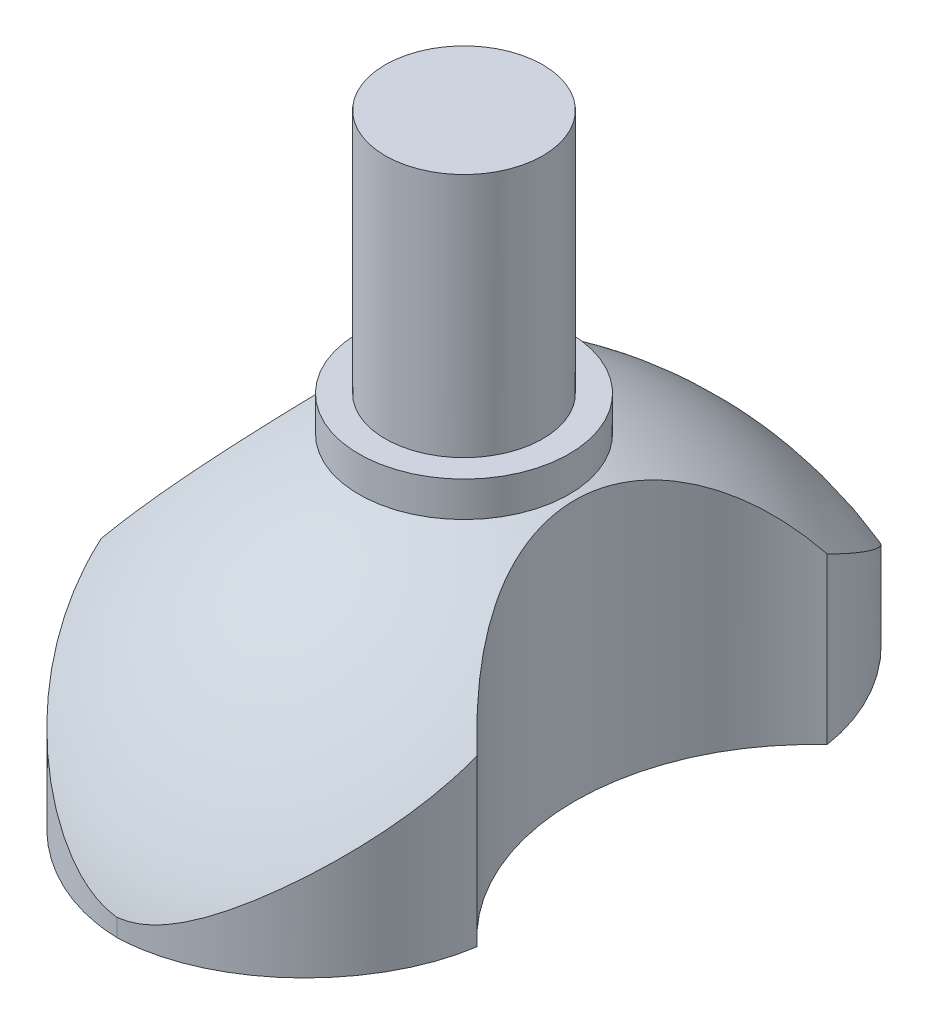
ISO-10303-21;
HEADER;
FILE_DESCRIPTION(('STEP AP214'),'2;1');
FILE_NAME('part.step','',(''),(''),'','','');
FILE_SCHEMA(('AUTOMOTIVE_DESIGN { 1 0 10303 214 1 1 1 1 }'));
ENDSEC;
DATA;
#1=APPLICATION_CONTEXT('core data for automotive mechanical design processes');
#2=APPLICATION_PROTOCOL_DEFINITION('international standard','automotive_design',2000,#1);
#3=PRODUCT_CONTEXT('',#1,'mechanical');
#4=PRODUCT('Part','Part','',(#3));
#5=PRODUCT_RELATED_PRODUCT_CATEGORY('part','',(#4));
#6=PRODUCT_DEFINITION_FORMATION('','',#4);
#7=PRODUCT_DEFINITION_CONTEXT('part definition',#1,'design');
#8=PRODUCT_DEFINITION('design','',#6,#7);
#9=PRODUCT_DEFINITION_SHAPE('','',#8);
#10=(LENGTH_UNIT() NAMED_UNIT(*) SI_UNIT(.MILLI.,.METRE.));
#11=(NAMED_UNIT(*) PLANE_ANGLE_UNIT() SI_UNIT($,.RADIAN.));
#12=(NAMED_UNIT(*) SI_UNIT($,.STERADIAN.) SOLID_ANGLE_UNIT());
#13=UNCERTAINTY_MEASURE_WITH_UNIT(LENGTH_MEASURE(1.E-05),#10,'distance_accuracy_value','');
#14=(GEOMETRIC_REPRESENTATION_CONTEXT(3) GLOBAL_UNCERTAINTY_ASSIGNED_CONTEXT((#13)) GLOBAL_UNIT_ASSIGNED_CONTEXT((#10,
#11,#12)) REPRESENTATION_CONTEXT('',''));
#15=CARTESIAN_POINT('',(0.,0.,0.));
#16=DIRECTION('',(0.,0.,1.));
#17=DIRECTION('',(1.,0.,0.));
#18=AXIS2_PLACEMENT_3D('',#15,#16,#17);
#19=CARTESIAN_POINT('',(0.,10.5,0.));
#20=DIRECTION('',(0.,-1.,0.));
#21=DIRECTION('',(0.,0.,-1.));
#22=AXIS2_PLACEMENT_3D('',#19,#20,#21);
#23=CYLINDRICAL_SURFACE('',#22,2.25);
#24=CARTESIAN_POINT('',(0.,-9.5,0.));
#25=DIRECTION('',(0.,-1.,0.));
#26=DIRECTION('',(0.,0.,-1.));
#27=AXIS2_PLACEMENT_3D('',#24,#25,#26);
#28=CIRCLE('',#27,2.25);
#29=CARTESIAN_POINT('',(0.,-9.5,-2.25));
#30=VERTEX_POINT('',#29);
#31=EDGE_CURVE('E366',#30,#30,#28,.T.);
#32=ORIENTED_EDGE('',*,*,#31,.F.);
#33=EDGE_LOOP('',(#32));
#34=FACE_BOUND('',#33,.T.);
#35=CARTESIAN_POINT('',(0.,-2.5,0.));
#36=DIRECTION('',(0.,1.,0.));
#37=DIRECTION('',(0.,0.,1.));
#38=AXIS2_PLACEMENT_3D('',#35,#36,#37);
#39=CIRCLE('',#38,2.25);
#40=CARTESIAN_POINT('',(0.,-2.5,2.25));
#41=VERTEX_POINT('',#40);
#42=EDGE_CURVE('E372',#41,#41,#39,.T.);
#43=ORIENTED_EDGE('',*,*,#42,.F.);
#44=EDGE_LOOP('',(#43));
#45=FACE_BOUND('',#44,.T.);
#46=ADVANCED_FACE('F84',(#34,#45),#23,.T.);
#47=CARTESIAN_POINT('',(0.,-21.1223259738244,0.));
#48=DIRECTION('',(0.,1.,0.));
#49=DIRECTION('',(0.,0.,1.));
#50=AXIS2_PLACEMENT_3D('',#47,#48,#49);
#51=DEGENERATE_TOROIDAL_SURFACE('',#50,0.75678197360062,11.2670856875838,.F.);
#52=CARTESIAN_POINT('',(-1.21778223944735E-13,-17.5,-9.91214367196992));
#53=CARTESIAN_POINT('',(0.0647477005345895,-17.4946067585579,-9.91031368422851));
#54=CARTESIAN_POINT('',(0.129249586201387,-17.4870614492552,-9.90711200341178));
#55=CARTESIAN_POINT('',(0.257252110956025,-17.4680748704095,-9.89811957970973));
#56=CARTESIAN_POINT('',(0.320755587004106,-17.4566482356384,-9.8923385371578));
#57=CARTESIAN_POINT('',(0.44667165352418,-17.4302753839606,-9.87833343250229));
#58=CARTESIAN_POINT('',(0.509085332201232,-17.4153329225815,-9.87011197476161));
#59=CARTESIAN_POINT('',(0.63176346858373,-17.3825996210537,-9.85152857628659));
#60=CARTESIAN_POINT('',(0.692046269754101,-17.3648569282479,-9.84120208299128));
#61=CARTESIAN_POINT('',(0.811429324134805,-17.3267366247479,-9.81847122950752));
#62=CARTESIAN_POINT('',(0.870528482638801,-17.306356694157,-9.80606503699899));
#63=CARTESIAN_POINT('',(0.987471619687195,-17.2633341117187,-9.7793164860475));
#64=CARTESIAN_POINT('',(1.04531504172813,-17.2406904806172,-9.76497328872617));
#65=CARTESIAN_POINT('',(1.23597203860407,-17.1620320563342,-9.71416187021926));
#66=CARTESIAN_POINT('',(1.36598082886827,-17.1017546389045,-9.67367885534412));
#67=CARTESIAN_POINT('',(1.61940805762656,-16.9742268462301,-9.58420001750592));
#68=CARTESIAN_POINT('',(1.74282397785496,-16.9069738349792,-9.53520097166048));
#69=CARTESIAN_POINT('',(1.98475438765377,-16.7672044417295,-9.42909059816223));
#70=CARTESIAN_POINT('',(2.10321176639496,-16.6946444532778,-9.37190721288339));
#71=CARTESIAN_POINT('',(2.33447257656536,-16.5464878782339,-9.2504167776728));
#72=CARTESIAN_POINT('',(2.44727412292801,-16.4708902941479,-9.18610737529229));
#73=CARTESIAN_POINT('',(2.64452073620498,-16.3337992541814,-9.06496516239648));
#74=CARTESIAN_POINT('',(2.72997307029374,-16.2726527169959,-9.00937052500072));
#75=CARTESIAN_POINT('',(2.89759254191193,-16.1495943370741,-8.89420920937448));
#76=CARTESIAN_POINT('',(2.97975935249957,-16.0876824189735,-8.83464213741347));
#77=CARTESIAN_POINT('',(3.22144545118996,-15.9012441340186,-8.6501793034527));
#78=CARTESIAN_POINT('',(3.37611645243204,-15.7760391307103,-8.51954292809712));
#79=CARTESIAN_POINT('',(3.67183744784265,-15.5257811030856,-8.24439762752949));
#80=CARTESIAN_POINT('',(3.81291419696271,-15.4007282791758,-8.09991711571389));
#81=CARTESIAN_POINT('',(4.08088472842309,-15.1513453111415,-7.79785028107827));
#82=CARTESIAN_POINT('',(4.20778257901542,-15.0270149694766,-7.64026774028153));
#83=CARTESIAN_POINT('',(4.43464827691055,-14.7912380255469,-7.32865339207626));
#84=CARTESIAN_POINT('',(4.53603085862786,-14.6796960017916,-7.17572225084255));
#85=CARTESIAN_POINT('',(4.72480081410834,-14.457461808117,-6.86078819901495));
#86=CARTESIAN_POINT('',(4.81218588834573,-14.3467697806739,-6.69878380374488));
#87=CARTESIAN_POINT('',(4.9711765577493,-14.1264697499647,-6.3672300578446));
#88=CARTESIAN_POINT('',(5.04282467270177,-14.0168596093757,-6.19770256362753));
#89=CARTESIAN_POINT('',(5.16890332412444,-13.7983260077099,-5.85203784857904));
#90=CARTESIAN_POINT('',(5.22334626420388,-13.689402107684,-5.67590549229403));
#91=CARTESIAN_POINT('',(5.28926290248487,-13.5301402923031,-5.41400317633487));
#92=CARTESIAN_POINT('',(5.30815914752043,-13.4795712847026,-5.33019392587244));
#93=CARTESIAN_POINT('',(5.34165611268871,-13.3785627364975,-5.1616792005404));
#94=CARTESIAN_POINT('',(5.35625807372028,-13.3281231626756,-5.07697399191548));
#95=CARTESIAN_POINT('',(5.36863090488632,-13.2777342750005,-4.99189260054224));
#96=B_SPLINE_CURVE_WITH_KNOTS('',3,(#52,#53,#54,#55,#56,#57,#58,#59,#60,#61,#62,#63,#64,#65,#66,
#67,#68,#69,#70,#71,#72,#73,#74,#75,#76,#77,#78,#79,#80,#81,#82,#83,#84,#85,#86,#87,#88,#89,#90,
#91,#92,#93,#94,#95),.UNSPECIFIED.,.F.,.F.,(4,2,2,2,2,2,2,2,2,2,2,2,2,2,2,2,2,2,2,2,2,4),(0.,
0.194902647755819,0.389078414018322,0.583047700208907,0.77398660462994,0.965094628657648,
1.15628568479612,1.60223463063321,2.04835271431165,2.49867248137015,2.94914135389517,
3.30565560866396,3.66220525225237,4.37544367016085,5.08724839031406,5.79884835001407,
6.4424216904455,7.08610064961366,7.72801844973967,8.36947241513621,8.66846196168819,
8.96736502556779),.UNSPECIFIED.);
#97=CARTESIAN_POINT('',(0.,-17.5,-9.91214367196991));
#98=VERTEX_POINT('',#97);
#99=CARTESIAN_POINT('',(5.36863090488632,-13.2777342750003,-4.99189260054224));
#100=VERTEX_POINT('',#99);
#101=EDGE_CURVE('E243',#98,#100,#96,.T.);
#102=ORIENTED_EDGE('',*,*,#101,.F.);
#103=CARTESIAN_POINT('',(0.,-17.5,-9.91214367196991));
#104=CARTESIAN_POINT('',(-0.0647477005346489,-17.4946067585579,-9.9103136842285));
#105=CARTESIAN_POINT('',(-0.129249586201438,-17.4870614492552,-9.90711200341177));
#106=CARTESIAN_POINT('',(-0.257252110956058,-17.4680748704095,-9.89811957970973));
#107=CARTESIAN_POINT('',(-0.32075558700413,-17.4566482356384,-9.8923385371578));
#108=CARTESIAN_POINT('',(-0.446671653524183,-17.4302753839605,-9.87833343250228));
#109=CARTESIAN_POINT('',(-0.509085332201223,-17.4153329225815,-9.87011197476161));
#110=CARTESIAN_POINT('',(-0.631763468583701,-17.3825996210537,-9.85152857628659));
#111=CARTESIAN_POINT('',(-0.692046269754065,-17.3648569282479,-9.84120208299128));
#112=CARTESIAN_POINT('',(-0.811429324134752,-17.3267366247479,-9.81847122950753));
#113=CARTESIAN_POINT('',(-0.870528482638737,-17.306356694157,-9.806065036999));
#114=CARTESIAN_POINT('',(-0.987471619687112,-17.2633341117187,-9.7793164860475));
#115=CARTESIAN_POINT('',(-1.04531504172804,-17.2406904806172,-9.76497328872619));
#116=CARTESIAN_POINT('',(-1.23597203860397,-17.1620320563342,-9.71416187021927));
#117=CARTESIAN_POINT('',(-1.36598082886816,-17.1017546389045,-9.67367885534413));
#118=CARTESIAN_POINT('',(-1.61940805762645,-16.9742268462301,-9.58420001750594));
#119=CARTESIAN_POINT('',(-1.74282397785485,-16.9069738349791,-9.5352009716605));
#120=CARTESIAN_POINT('',(-1.98475438765365,-16.7672044417295,-9.42909059816225));
#121=CARTESIAN_POINT('',(-2.10321176639484,-16.6946444532778,-9.37190721288341));
#122=CARTESIAN_POINT('',(-2.33447257656524,-16.5464878782339,-9.25041677767282));
#123=CARTESIAN_POINT('',(-2.44727412292789,-16.4708902941479,-9.18610737529231));
#124=CARTESIAN_POINT('',(-2.64452073620486,-16.3337992541813,-9.0649651623965));
#125=CARTESIAN_POINT('',(-2.72997307029363,-16.2726527169959,-9.00937052500075));
#126=CARTESIAN_POINT('',(-2.89759254191183,-16.1495943370741,-8.89420920937449));
#127=CARTESIAN_POINT('',(-2.97975935249947,-16.0876824189734,-8.83464213741348));
#128=CARTESIAN_POINT('',(-3.22144545118988,-15.9012441340186,-8.65017930345269));
#129=CARTESIAN_POINT('',(-3.37611645243197,-15.7760391307103,-8.51954292809711));
#130=CARTESIAN_POINT('',(-3.67183744784261,-15.5257811030856,-8.24439762752947));
#131=CARTESIAN_POINT('',(-3.81291419696268,-15.4007282791757,-8.09991711571386));
#132=CARTESIAN_POINT('',(-4.08088472842308,-15.1513453111415,-7.79785028107822));
#133=CARTESIAN_POINT('',(-4.20778257901541,-15.0270149694765,-7.64026774028147));
#134=CARTESIAN_POINT('',(-4.43464827691055,-14.7912380255468,-7.32865339207619));
#135=CARTESIAN_POINT('',(-4.53603085862787,-14.6796960017915,-7.17572225084249));
#136=CARTESIAN_POINT('',(-4.72480081410834,-14.4574618081169,-6.8607881990149));
#137=CARTESIAN_POINT('',(-4.81218588834572,-14.3467697806738,-6.69878380374483));
#138=CARTESIAN_POINT('',(-4.97117655774929,-14.1264697499647,-6.36723005784458));
#139=CARTESIAN_POINT('',(-5.04282467270177,-14.0168596093757,-6.19770256362751));
#140=CARTESIAN_POINT('',(-5.16890332412444,-13.7983260077099,-5.85203784857903));
#141=CARTESIAN_POINT('',(-5.22334626420387,-13.689402107684,-5.67590549229403));
#142=CARTESIAN_POINT('',(-5.28926290248487,-13.5301402923031,-5.41400317633487));
#143=CARTESIAN_POINT('',(-5.30815914752042,-13.4795712847026,-5.33019392587244));
#144=CARTESIAN_POINT('',(-5.34165611268871,-13.3785627364975,-5.16167920054041));
#145=CARTESIAN_POINT('',(-5.35625807372027,-13.3281231626756,-5.07697399191549));
#146=CARTESIAN_POINT('',(-5.36863090488632,-13.2777342750005,-4.99189260054224));
#147=B_SPLINE_CURVE_WITH_KNOTS('',3,(#103,#104,#105,#106,#107,#108,#109,#110,#111,#112,#113,
#114,#115,#116,#117,#118,#119,#120,#121,#122,#123,#124,#125,#126,#127,#128,#129,#130,#131,#132,
#133,#134,#135,#136,#137,#138,#139,#140,#141,#142,#143,#144,#145,#146),.UNSPECIFIED.,.F.,.F.,(4,
2,2,2,2,2,2,2,2,2,2,2,2,2,2,2,2,2,2,2,2,4),(0.,0.19490264775579,0.389078414018266,
0.583047700208822,0.773986604629827,0.965094628657508,1.15628568479595,1.60223463063304,
2.04835271431148,2.49867248136997,2.94914135389498,3.30565560866381,3.66220525225223,
4.37544367016076,5.08724839031401,5.79884835001406,6.44242169044546,7.08610064961359,
7.72801844973957,8.36947241513609,8.66846196168807,8.96736502556768),.UNSPECIFIED.);
#148=CARTESIAN_POINT('',(-5.36863090488631,-13.2777342750005,-4.99189260054225));
#149=VERTEX_POINT('',#148);
#150=EDGE_CURVE('E202',#98,#149,#147,.T.);
#151=ORIENTED_EDGE('',*,*,#150,.T.);
#152=CARTESIAN_POINT('',(-5.36883090488642,-13.2780130804902,-4.99207462889494));
#153=CARTESIAN_POINT('',(-5.27535609658321,-13.1477010865516,-4.90699335529709));
#154=CARTESIAN_POINT('',(-5.18196344268316,-13.0204440789122,-4.81720215599376));
#155=CARTESIAN_POINT('',(-4.99635504739702,-12.7724065703114,-4.62765279085653));
#156=CARTESIAN_POINT('',(-4.90414060708838,-12.6516328248321,-4.52788452737752));
#157=CARTESIAN_POINT('',(-4.62982953154358,-12.2983748828887,-4.21163080564306));
#158=CARTESIAN_POINT('',(-4.45137621821553,-12.0767533304604,-3.97934842613928));
#159=CARTESIAN_POINT('',(-4.13547890590171,-11.6930802906074,-3.50205874898593));
#160=CARTESIAN_POINT('',(-3.99568144615711,-11.5270804514505,-3.26183433458899));
#161=CARTESIAN_POINT('',(-3.80487493080433,-11.3030195236937,-2.8782221430621));
#162=CARTESIAN_POINT('',(-3.74447210993188,-11.2325471590438,-2.74661556295001));
#163=CARTESIAN_POINT('',(-3.63092800284866,-11.100565811303,-2.47595149900243));
#164=CARTESIAN_POINT('',(-3.57778542291686,-11.0390552311586,-2.33689534878903));
#165=CARTESIAN_POINT('',(-3.48784559525522,-10.9351243283966,-2.07527982690474));
#166=CARTESIAN_POINT('',(-3.44979631275813,-10.8912268731226,-1.95373503077379));
#167=CARTESIAN_POINT('',(-3.38013640371041,-10.8108715624063,-1.70642177171612));
#168=CARTESIAN_POINT('',(-3.34852452054477,-10.7744122549948,-1.5806541387043));
#169=CARTESIAN_POINT('',(-3.29228462719624,-10.7094961903514,-1.32552938164424));
#170=CARTESIAN_POINT('',(-3.26765665640189,-10.6810394782532,-1.19617223735604));
#171=CARTESIAN_POINT('',(-3.22586655469137,-10.6326934119998,-0.934726080354175));
#172=CARTESIAN_POINT('',(-3.20870123885006,-10.6128004030477,-0.802638258307303));
#173=CARTESIAN_POINT('',(-3.18211534350614,-10.5819592567908,-0.535966879445243));
#174=CARTESIAN_POINT('',(-3.17273379236871,-10.5710561974246,-0.401374164654344));
#175=CARTESIAN_POINT('',(-3.16207186344806,-10.5586630711623,-0.131433291967229));
#176=CARTESIAN_POINT('',(-3.16079141556218,-10.557172922812,0.00391485938169381));
#177=CARTESIAN_POINT('',(-3.16636146250929,-10.56364933372,0.274223973664342));
#178=CARTESIAN_POINT('',(-3.17321253692984,-10.5716165670687,0.409184908311222));
#179=CARTESIAN_POINT('',(-3.19488940996727,-10.5967822542187,0.677587634762747));
#180=CARTESIAN_POINT('',(-3.20971508426506,-10.6139805641132,0.811029450216411));
#181=CARTESIAN_POINT('',(-3.24558881225554,-10.6555175402743,1.06523982183928));
#182=CARTESIAN_POINT('',(-3.26607235453258,-10.6792073227387,1.18619535942318));
#183=CARTESIAN_POINT('',(-3.31321130891947,-10.7336596123874,1.42529416163185));
#184=CARTESIAN_POINT('',(-3.33986880443375,-10.764424507048,1.54343646205319));
#185=CARTESIAN_POINT('',(-3.42846608515182,-10.8666196842203,1.89260422147759));
#186=CARTESIAN_POINT('',(-3.49906821569414,-10.9479939081403,2.11862778935989));
#187=CARTESIAN_POINT('',(-3.66853510361632,-11.1441203822955,2.57807915535037));
#188=CARTESIAN_POINT('',(-3.7696885774862,-11.261601090899,2.80946971443188));
#189=CARTESIAN_POINT('',(-3.9904632091592,-11.5210636465043,3.24913025267281));
#190=CARTESIAN_POINT('',(-4.11012506650862,-11.6630995729591,3.45734749593119));
#191=CARTESIAN_POINT('',(-4.32289803154928,-11.92037074524,3.78794974762746));
#192=CARTESIAN_POINT('',(-4.41265481752965,-12.0301545758416,3.91685506433931));
#193=CARTESIAN_POINT('',(-4.59666236256604,-12.2587180989238,4.16314619465189));
#194=CARTESIAN_POINT('',(-4.690915798484,-12.3775031752482,4.28052501609932));
#195=CARTESIAN_POINT('',(-4.88178525052645,-12.6224965361955,4.50326567646799));
#196=CARTESIAN_POINT('',(-4.97838594210281,-12.7486617403222,4.60868840498661));
#197=CARTESIAN_POINT('',(-5.17292147963193,-13.0081274920236,4.80850116974975));
#198=CARTESIAN_POINT('',(-5.27085436400221,-13.14141825001,4.90290580293017));
#199=CARTESIAN_POINT('',(-5.36883090488642,-13.2780130804902,4.99207462889494));
#200=B_SPLINE_CURVE_WITH_KNOTS('',3,(#152,#153,#154,#155,#156,#157,#158,#159,#160,#161,#162,
#163,#164,#165,#166,#167,#168,#169,#170,#171,#172,#173,#174,#175,#176,#177,#178,#179,#180,#181,
#182,#183,#184,#185,#186,#187,#188,#189,#190,#191,#192,#193,#194,#195,#196,#197,#198,#199),
.UNSPECIFIED.,.F.,.F.,(4,2,2,2,2,2,2,2,2,2,2,2,2,2,2,2,2,2,2,2,2,2,2,4),(0.,0.544457565105858,
1.08947185471803,2.18695859114245,3.15417933203535,3.63682393356446,4.11938241891897,
4.52313402423819,4.92680673935848,5.33048173110563,5.7339842721948,6.13949798252163,
6.54500818374266,6.95054729010276,7.35608007454108,7.73050672345619,8.1050599074529,
8.85338389275275,9.68605954138588,10.5205929643013,11.0949290981871,11.6696115086398,
12.2412215888459,12.8120655825852),.UNSPECIFIED.);
#201=CARTESIAN_POINT('',(-5.36863090488634,-13.2777342750009,4.99189260054269));
#202=VERTEX_POINT('',#201);
#203=EDGE_CURVE('E106',#149,#202,#200,.T.);
#204=ORIENTED_EDGE('',*,*,#203,.T.);
#205=CARTESIAN_POINT('',(0.,-17.5,9.91214367196992));
#206=CARTESIAN_POINT('',(-0.0647477005344992,-17.494606758558,9.91031368422855));
#207=CARTESIAN_POINT('',(-0.129249586201094,-17.4870614492555,9.90711200341186));
#208=CARTESIAN_POINT('',(-0.257252110955337,-17.46807487041,9.89811957970992));
#209=CARTESIAN_POINT('',(-0.320755587003227,-17.456648235639,9.89233853715805));
#210=CARTESIAN_POINT('',(-0.446671653522927,-17.4302753839615,9.87833343250266));
#211=CARTESIAN_POINT('',(-0.509085332199795,-17.4153329225825,9.87011197476205));
#212=CARTESIAN_POINT('',(-0.63176346858194,-17.3825996210551,9.85152857628718));
#213=CARTESIAN_POINT('',(-0.692046269752142,-17.3648569282494,9.84120208299195));
#214=CARTESIAN_POINT('',(-0.811429324132509,-17.3267366247497,9.81847122950835));
#215=CARTESIAN_POINT('',(-0.870528482636339,-17.306356694159,9.80606503699991));
#216=CARTESIAN_POINT('',(-0.987471619684407,-17.2633341117209,9.77931648604859));
#217=CARTESIAN_POINT('',(-1.04531504172518,-17.2406904806196,9.76497328872737));
#218=CARTESIAN_POINT('',(-1.23597203860048,-17.1620320563371,9.71416187022082));
#219=CARTESIAN_POINT('',(-1.36598082886422,-17.1017546389078,9.67367885534597));
#220=CARTESIAN_POINT('',(-1.61940805762162,-16.9742268462343,9.58420001750841));
#221=CARTESIAN_POINT('',(-1.7428239778496,-16.9069738349837,9.53520097166332));
#222=CARTESIAN_POINT('',(-1.98475438764757,-16.7672044417348,9.42909059816581));
#223=CARTESIAN_POINT('',(-2.10321176638836,-16.6946444532836,9.37190721288737));
#224=CARTESIAN_POINT('',(-2.334472576558,-16.5464878782404,9.25041677767763));
#225=CARTESIAN_POINT('',(-2.44727412292028,-16.4708902941548,9.18610737529756));
#226=CARTESIAN_POINT('',(-2.64452073619691,-16.3337992541887,9.06496516240242));
#227=CARTESIAN_POINT('',(-2.72997307028567,-16.2726527170033,9.00937052500687));
#228=CARTESIAN_POINT('',(-2.89759254190387,-16.1495943370817,8.89420920938103));
#229=CARTESIAN_POINT('',(-2.97975935249152,-16.0876824189811,8.83464213742022));
#230=CARTESIAN_POINT('',(-3.22144545118193,-15.9012441340265,8.65017930346007));
#231=CARTESIAN_POINT('',(-3.37611645242404,-15.7760391307183,8.51954292810491));
#232=CARTESIAN_POINT('',(-3.67183744783475,-15.5257811030938,8.24439762753814));
#233=CARTESIAN_POINT('',(-3.81291419695487,-15.400728279184,8.09991711572297));
#234=CARTESIAN_POINT('',(-4.08088472841544,-15.15134531115,7.79785028108823));
#235=CARTESIAN_POINT('',(-4.20778257900789,-15.0270149694851,7.64026774029194));
#236=CARTESIAN_POINT('',(-4.43464827690352,-14.7912380255554,7.32865339208724));
#237=CARTESIAN_POINT('',(-4.53603085862119,-14.6796960017999,7.17572225085365));
#238=CARTESIAN_POINT('',(-4.72480081410239,-14.4574618081251,6.86078819902623));
#239=CARTESIAN_POINT('',(-4.81218588834014,-14.3467697806818,6.69878380375624));
#240=CARTESIAN_POINT('',(-4.97117655774446,-14.1264697499724,6.36723005785609));
#241=CARTESIAN_POINT('',(-5.04282467269731,-14.0168596093832,6.19770256363906));
#242=CARTESIAN_POINT('',(-5.16890332412077,-13.7983260077172,5.85203784859062));
#243=CARTESIAN_POINT('',(-5.2233462642006,-13.6894021076912,5.67590549230561));
#244=CARTESIAN_POINT('',(-5.28926290248263,-13.530140292309,5.41400317634466));
#245=CARTESIAN_POINT('',(-5.30815914751873,-13.4795712847074,5.33019392588044));
#246=CARTESIAN_POINT('',(-5.34165611268792,-13.3785627365001,5.16167920054477));
#247=CARTESIAN_POINT('',(-5.35625807371984,-13.3281231626771,5.07697399191801));
#248=CARTESIAN_POINT('',(-5.36863090488615,-13.2777342750009,4.99189260054291));
#249=B_SPLINE_CURVE_WITH_KNOTS('',3,(#205,#206,#207,#208,#209,#210,#211,#212,#213,#214,#215,
#216,#217,#218,#219,#220,#221,#222,#223,#224,#225,#226,#227,#228,#229,#230,#231,#232,#233,#234,
#235,#236,#237,#238,#239,#240,#241,#242,#243,#244,#245,#246,#247,#248),.UNSPECIFIED.,.F.,.F.,(4,
2,2,2,2,2,2,2,2,2,2,2,2,2,2,2,2,2,2,2,2,4),(0.,0.194902647755163,0.389078414017015,
0.583047700206947,0.773986604627332,0.965094628654391,1.15628568479221,1.60223463062736,
2.04835271430385,2.49867248136039,2.94914135388344,3.30565560865182,3.66220525223981,
4.37544367014748,5.08724839029987,5.79884834999906,6.44242169043097,7.08610064959961,
7.72801844972609,8.36947241512311,8.66846196168163,8.96736502556778),.UNSPECIFIED.);
#250=CARTESIAN_POINT('',(0.,-17.5,9.91214367196992));
#251=VERTEX_POINT('',#250);
#252=EDGE_CURVE('E189',#251,#202,#249,.T.);
#253=ORIENTED_EDGE('',*,*,#252,.F.);
#254=CARTESIAN_POINT('',(0.,-17.5,9.91214367196992));
#255=CARTESIAN_POINT('',(0.0647477005347479,-17.4946067585579,9.91031368422851));
#256=CARTESIAN_POINT('',(0.129249586201582,-17.4870614492552,9.90711200341177));
#257=CARTESIAN_POINT('',(0.257252110956294,-17.4680748704095,9.89811957970972));
#258=CARTESIAN_POINT('',(0.320755587004412,-17.4566482356384,9.89233853715779));
#259=CARTESIAN_POINT('',(0.446671653524558,-17.4302753839605,9.87833343250226));
#260=CARTESIAN_POINT('',(0.509085332201644,-17.4153329225814,9.87011197476158));
#261=CARTESIAN_POINT('',(0.631763468584214,-17.3825996210537,9.85152857628654));
#262=CARTESIAN_POINT('',(0.692046269754624,-17.3648569282479,9.84120208299123));
#263=CARTESIAN_POINT('',(0.811429324135403,-17.3267366247479,9.81847122950745));
#264=CARTESIAN_POINT('',(0.870528482639435,-17.306356694157,9.80606503699892));
#265=CARTESIAN_POINT('',(0.9874716196879,-17.2633341117186,9.7793164860474));
#266=CARTESIAN_POINT('',(1.04531504172887,-17.2406904806172,9.76497328872607));
#267=CARTESIAN_POINT('',(1.2359720386049,-17.1620320563341,9.71416187021912));
#268=CARTESIAN_POINT('',(1.36598082886917,-17.1017546389044,9.67367885534396));
#269=CARTESIAN_POINT('',(1.61940805762759,-16.97422684623,9.5842000175057));
#270=CARTESIAN_POINT('',(1.74282397785606,-16.906973834979,9.53520097166024));
#271=CARTESIAN_POINT('',(1.98475438765498,-16.7672044417293,9.42909059816192));
#272=CARTESIAN_POINT('',(2.10321176639623,-16.6946444532777,9.37190721288305));
#273=CARTESIAN_POINT('',(2.33447257656673,-16.5464878782337,9.25041677767239));
#274=CARTESIAN_POINT('',(2.44727412292944,-16.4708902941478,9.18610737529183));
#275=CARTESIAN_POINT('',(2.64452073620643,-16.3337992541812,9.06496516239599));
#276=CARTESIAN_POINT('',(2.72997307029517,-16.2726527169958,9.00937052500024));
#277=CARTESIAN_POINT('',(2.89759254191331,-16.1495943370741,8.89420920937402));
#278=CARTESIAN_POINT('',(2.97975935250092,-16.0876824189735,8.83464213741301));
#279=CARTESIAN_POINT('',(3.22144545119124,-15.9012441340187,8.65017930345228));
#280=CARTESIAN_POINT('',(3.37611645243327,-15.7760391307105,8.51954292809672));
#281=CARTESIAN_POINT('',(3.67183744784378,-15.5257811030859,8.24439762752916));
#282=CARTESIAN_POINT('',(3.81291419696379,-15.4007282791761,8.0999171157136));
#283=CARTESIAN_POINT('',(4.08088472842406,-15.151345311142,7.79785028107807));
#284=CARTESIAN_POINT('',(4.20778257901633,-15.0270149694771,7.64026774028137));
#285=CARTESIAN_POINT('',(4.43464827691136,-14.7912380255474,7.32865339207618));
#286=CARTESIAN_POINT('',(4.53603085862862,-14.6796960017922,7.17572225084252));
#287=CARTESIAN_POINT('',(4.724800814109,-14.4574618081176,6.86078819901501));
#288=CARTESIAN_POINT('',(4.81218588834633,-14.3467697806745,6.69878380374499));
#289=CARTESIAN_POINT('',(4.9711765577498,-14.1264697499653,6.36723005784482));
#290=CARTESIAN_POINT('',(5.04282467270221,-14.0168596093763,6.19770256362781));
#291=CARTESIAN_POINT('',(5.16890332412478,-13.7983260077105,5.85203784857944));
#292=CARTESIAN_POINT('',(5.22334626420416,-13.6894021076846,5.67590549229449));
#293=CARTESIAN_POINT('',(5.28926290248505,-13.5301402923038,5.41400317633555));
#294=CARTESIAN_POINT('',(5.30815914752056,-13.4795712847033,5.33019392587327));
#295=CARTESIAN_POINT('',(5.34165611268877,-13.3785627364984,5.16167920054156));
#296=CARTESIAN_POINT('',(5.3562580737203,-13.3281231626766,5.0769739919168));
#297=CARTESIAN_POINT('',(5.36863090488632,-13.2777342750015,4.99189260054371));
#298=B_SPLINE_CURVE_WITH_KNOTS('',3,(#254,#255,#256,#257,#258,#259,#260,#261,#262,#263,#264,
#265,#266,#267,#268,#269,#270,#271,#272,#273,#274,#275,#276,#277,#278,#279,#280,#281,#282,#283,
#284,#285,#286,#287,#288,#289,#290,#291,#292,#293,#294,#295,#296,#297),.UNSPECIFIED.,.F.,.F.,(4,
2,2,2,2,2,2,2,2,2,2,2,2,2,2,2,2,2,2,2,2,4),(0.,0.194902647755929,0.389078414018542,
0.583047700209236,0.773986604630382,0.965094628658202,1.15628568479678,1.60223463063406,
2.0483527143127,2.49867248137138,2.94914135389658,3.30565560866526,3.66220525225354,
4.37544367016178,5.08724839031475,5.79884835001452,6.44242169044575,7.08610064961372,
7.72801844973953,8.36947241513588,8.66846196168733,8.96736502556641),.UNSPECIFIED.);
#299=CARTESIAN_POINT('',(5.36863090488669,-13.2777342750015,4.99189260054331));
#300=VERTEX_POINT('',#299);
#301=EDGE_CURVE('E146',#251,#300,#298,.T.);
#302=ORIENTED_EDGE('',*,*,#301,.T.);
#303=CARTESIAN_POINT('',(5.36883090488676,-13.2780130804906,-4.9920746288952));
#304=CARTESIAN_POINT('',(5.27535609658355,-13.1477010865521,-4.90699335529736));
#305=CARTESIAN_POINT('',(5.18196344268349,-13.0204440789126,-4.81720215599403));
#306=CARTESIAN_POINT('',(4.99635504739733,-12.7724065703118,-4.62765279085681));
#307=CARTESIAN_POINT('',(4.90414060708869,-12.6516328248325,-4.52788452737779));
#308=CARTESIAN_POINT('',(4.62982953154385,-12.298374882889,-4.21163080564334));
#309=CARTESIAN_POINT('',(4.45137621821578,-12.0767533304607,-3.97934842613955));
#310=CARTESIAN_POINT('',(4.13547890590193,-11.6930802906077,-3.50205874898621));
#311=CARTESIAN_POINT('',(3.99568144615731,-11.5270804514507,-3.26183433458927));
#312=CARTESIAN_POINT('',(3.80487493080452,-11.3030195236939,-2.87822214306238));
#313=CARTESIAN_POINT('',(3.74447210993206,-11.2325471590439,-2.7466155629503));
#314=CARTESIAN_POINT('',(3.63092800284883,-11.1005658113032,-2.47595149900272));
#315=CARTESIAN_POINT('',(3.57778542291702,-11.0390552311587,-2.33689534878931));
#316=CARTESIAN_POINT('',(3.48784559525537,-10.9351243283967,-2.07527982690503));
#317=CARTESIAN_POINT('',(3.44979631275826,-10.8912268731227,-1.95373503077408));
#318=CARTESIAN_POINT('',(3.38013640371054,-10.8108715624064,-1.70642177171641));
#319=CARTESIAN_POINT('',(3.34852452054489,-10.7744122549949,-1.58065413870459));
#320=CARTESIAN_POINT('',(3.29228462719635,-10.7094961903515,-1.32552938164453));
#321=CARTESIAN_POINT('',(3.267656656402,-10.6810394782533,-1.19617223735633));
#322=CARTESIAN_POINT('',(3.22586655469146,-10.6326934119999,-0.934726080354461));
#323=CARTESIAN_POINT('',(3.20870123885015,-10.6128004030477,-0.802638258307587));
#324=CARTESIAN_POINT('',(3.18211534350621,-10.5819592567908,-0.535966879445523));
#325=CARTESIAN_POINT('',(3.17273379236878,-10.5710561974246,-0.401374164654621));
#326=CARTESIAN_POINT('',(3.16207186344812,-10.5586630711623,-0.131433291967501));
#327=CARTESIAN_POINT('',(3.16079141556223,-10.557172922812,0.00391485938142512));
#328=CARTESIAN_POINT('',(3.16636146250933,-10.56364933372,0.274223973664081));
#329=CARTESIAN_POINT('',(3.17321253692987,-10.5716165670687,0.409184908310965));
#330=CARTESIAN_POINT('',(3.1948894099673,-10.5967822542187,0.6775876347625));
#331=CARTESIAN_POINT('',(3.20971508426508,-10.6139805641132,0.811029450216168));
#332=CARTESIAN_POINT('',(3.24558881225556,-10.6555175402743,1.06523982183904));
#333=CARTESIAN_POINT('',(3.26607235453259,-10.6792073227387,1.18619535942295));
#334=CARTESIAN_POINT('',(3.31321130891947,-10.7336596123873,1.42529416163162));
#335=CARTESIAN_POINT('',(3.33986880443375,-10.764424507048,1.54343646205296));
#336=CARTESIAN_POINT('',(3.4284660851518,-10.8666196842203,1.89260422147736));
#337=CARTESIAN_POINT('',(3.49906821569412,-10.9479939081402,2.11862778935967));
#338=CARTESIAN_POINT('',(3.66853510361628,-11.1441203822954,2.57807915535015));
#339=CARTESIAN_POINT('',(3.76968857748615,-11.2616010908989,2.80946971443166));
#340=CARTESIAN_POINT('',(3.99046320915913,-11.5210636465042,3.24913025267259));
#341=CARTESIAN_POINT('',(4.11012506650855,-11.663099572959,3.45734749593097));
#342=CARTESIAN_POINT('',(4.32289803154923,-11.9203707452399,3.7879497476273));
#343=CARTESIAN_POINT('',(4.41265481752963,-12.0301545758415,3.9168550643392));
#344=CARTESIAN_POINT('',(4.59666236256609,-12.2587180989238,4.16314619465188));
#345=CARTESIAN_POINT('',(4.69091579848408,-12.3775031752482,4.28052501609936));
#346=CARTESIAN_POINT('',(4.8817852505266,-12.6224965361957,4.50326567646811));
#347=CARTESIAN_POINT('',(4.97838594210301,-12.7486617403224,4.60868840498677));
#348=CARTESIAN_POINT('',(5.1729214796322,-13.008127492024,4.80850116974997));
#349=CARTESIAN_POINT('',(5.27085436400252,-13.1414182500104,4.90290580293042));
#350=CARTESIAN_POINT('',(5.36883090488677,-13.2780130804906,4.99207462889521));
#351=B_SPLINE_CURVE_WITH_KNOTS('',3,(#303,#304,#305,#306,#307,#308,#309,#310,#311,#312,#313,
#314,#315,#316,#317,#318,#319,#320,#321,#322,#323,#324,#325,#326,#327,#328,#329,#330,#331,#332,
#333,#334,#335,#336,#337,#338,#339,#340,#341,#342,#343,#344,#345,#346,#347,#348,#349,#350),
.UNSPECIFIED.,.F.,.F.,(4,2,2,2,2,2,2,2,2,2,2,2,2,2,2,2,2,2,2,2,2,2,2,4),(0.,0.544457565105901,
1.08947185471812,2.18695859114263,3.15417933203557,3.6368239335647,4.11938241891922,
4.52313402423846,4.92680673935876,5.33048173110591,5.73398427219509,6.13949798252193,
6.54500818374297,6.95054729010308,7.35608007454142,7.73050672345653,8.10505990745323,
8.85338389275308,9.68605954138618,10.5205929643016,11.0949290981876,11.6696115086405,
12.2412215888469,12.8120655825864),.UNSPECIFIED.);
#352=EDGE_CURVE('E172',#100,#300,#351,.T.);
#353=ORIENTED_EDGE('',*,*,#352,.F.);
#354=EDGE_LOOP('',(#102,#151,#204,#253,#302,#353));
#355=FACE_BOUND('',#354,.T.);
#356=CARTESIAN_POINT('',(0.,-10.5,0.));
#357=DIRECTION('',(0.,-1.,0.));
#358=DIRECTION('',(0.,0.,-1.));
#359=AXIS2_PLACEMENT_3D('',#356,#357,#358);
#360=CIRCLE('',#359,3.);
#361=CARTESIAN_POINT('',(0.,-10.5,-3.));
#362=VERTEX_POINT('',#361);
#363=EDGE_CURVE('E94',#362,#362,#360,.T.);
#364=ORIENTED_EDGE('',*,*,#363,.T.);
#365=EDGE_LOOP('',(#364));
#366=FACE_BOUND('',#365,.T.);
#367=ADVANCED_FACE('F209',(#355,#366),#51,.F.);
#368=CARTESIAN_POINT('',(0.,-18.,0.));
#369=DIRECTION('',(0.,-1.,0.));
#370=DIRECTION('',(0.,0.,-1.));
#371=AXIS2_PLACEMENT_3D('',#368,#369,#370);
#372=PLANE('',#371);
#373=CARTESIAN_POINT('',(0.,-18.,0.));
#374=DIRECTION('',(0.,-1.,0.));
#375=DIRECTION('',(0.,0.,-1.));
#376=AXIS2_PLACEMENT_3D('',#373,#374,#375);
#377=CIRCLE('',#376,0.5);
#378=CARTESIAN_POINT('',(0.,-18.,-0.5));
#379=VERTEX_POINT('',#378);
#380=EDGE_CURVE('E265',#379,#379,#377,.T.);
#381=ORIENTED_EDGE('',*,*,#380,.F.);
#382=EDGE_LOOP('',(#381));
#383=FACE_BOUND('',#382,.T.);
#384=CARTESIAN_POINT('',(5.36863090488632,-18.,-4.99189260054224));
#385=CARTESIAN_POINT('',(4.99811919555962,-18.,-7.5396828566043));
#386=CARTESIAN_POINT('',(2.61636403506015,-18.,-9.83793781393195));
#387=CARTESIAN_POINT('',(0.,-18.,-9.91214367196991));
#388=B_SPLINE_CURVE_WITH_KNOTS('',3,(#384,#385,#386,#387),.UNSPECIFIED.,.F.,.F.,(4,4),(0.,1.),.UNSPECIFIED.);
#389=CARTESIAN_POINT('',(5.36863090488632,-18.,-4.99189260054224));
#390=VERTEX_POINT('',#389);
#391=CARTESIAN_POINT('',(0.,-18.,-9.91214367196991));
#392=VERTEX_POINT('',#391);
#393=EDGE_CURVE('E284',#390,#392,#388,.T.);
#394=ORIENTED_EDGE('',*,*,#393,.F.);
#395=CARTESIAN_POINT('',(9.91214367196992,-18.,0.));
#396=DIRECTION('',(0.,-1.,0.));
#397=DIRECTION('',(0.,0.,-1.));
#398=AXIS2_PLACEMENT_3D('',#395,#396,#397);
#399=CIRCLE('',#398,6.75);
#400=CARTESIAN_POINT('',(5.36863090488669,-18.,4.99189260054331));
#401=VERTEX_POINT('',#400);
#402=EDGE_CURVE('E160',#401,#390,#399,.T.);
#403=ORIENTED_EDGE('',*,*,#402,.F.);
#404=CARTESIAN_POINT('',(5.36863090488632,-18.,4.99189260054371));
#405=CARTESIAN_POINT('',(4.99811919555961,-18.,7.53968285660577));
#406=CARTESIAN_POINT('',(2.61636403506015,-18.,9.83793781393196));
#407=CARTESIAN_POINT('',(0.,-18.,9.91214367196992));
#408=B_SPLINE_CURVE_WITH_KNOTS('',3,(#404,#405,#406,#407),.UNSPECIFIED.,.F.,.F.,(4,4),(0.,1.),.UNSPECIFIED.);
#409=CARTESIAN_POINT('',(0.,-18.,9.91214367196992));
#410=VERTEX_POINT('',#409);
#411=EDGE_CURVE('E143',#401,#410,#408,.T.);
#412=ORIENTED_EDGE('',*,*,#411,.T.);
#413=CARTESIAN_POINT('',(-5.36863090488615,-18.,4.99189260054291));
#414=CARTESIAN_POINT('',(-4.99811919555961,-18.,7.53968285660497));
#415=CARTESIAN_POINT('',(-2.61636403506014,-18.,9.83793781393331));
#416=CARTESIAN_POINT('',(0.,-18.,9.91214367196992));
#417=B_SPLINE_CURVE_WITH_KNOTS('',3,(#413,#414,#415,#416),.UNSPECIFIED.,.F.,.F.,(4,4),(0.,1.),.UNSPECIFIED.);
#418=CARTESIAN_POINT('',(-5.36863090488615,-18.,4.99189260054291));
#419=VERTEX_POINT('',#418);
#420=EDGE_CURVE('E158',#419,#410,#417,.T.);
#421=ORIENTED_EDGE('',*,*,#420,.F.);
#422=CARTESIAN_POINT('',(-9.91214367196987,-18.,0.));
#423=DIRECTION('',(0.,-1.,0.));
#424=DIRECTION('',(0.,0.,-1.));
#425=AXIS2_PLACEMENT_3D('',#422,#423,#424);
#426=CIRCLE('',#425,6.75);
#427=CARTESIAN_POINT('',(-5.36863090488631,-18.,-4.99189260054225));
#428=VERTEX_POINT('',#427);
#429=EDGE_CURVE('E101',#419,#428,#426,.F.);
#430=ORIENTED_EDGE('',*,*,#429,.T.);
#431=CARTESIAN_POINT('',(-5.36863090488632,-18.,-4.99189260054224));
#432=CARTESIAN_POINT('',(-4.99811919555961,-18.,-7.5396828566043));
#433=CARTESIAN_POINT('',(-2.61636403505996,-18.0000000000007,-9.83793781393196));
#434=CARTESIAN_POINT('',(0.,-18.,-9.91214367196991));
#435=B_SPLINE_CURVE_WITH_KNOTS('',3,(#431,#432,#433,#434),.UNSPECIFIED.,.F.,.F.,(4,4),(0.,1.),.UNSPECIFIED.);
#436=EDGE_CURVE('E166',#428,#392,#435,.T.);
#437=ORIENTED_EDGE('',*,*,#436,.T.);
#438=EDGE_LOOP('',(#394,#403,#412,#421,#430,#437));
#439=FACE_BOUND('',#438,.T.);
#440=ADVANCED_FACE('F157',(#383,#439),#372,.T.);
#441=CARTESIAN_POINT('',(0.,-10.5,0.));
#442=DIRECTION('',(0.,1.,0.));
#443=DIRECTION('',(0.,0.,1.));
#444=AXIS2_PLACEMENT_3D('',#441,#442,#443);
#445=CYLINDRICAL_SURFACE('',#444,3.);
#446=ORIENTED_EDGE('',*,*,#363,.F.);
#447=EDGE_LOOP('',(#446));
#448=FACE_BOUND('',#447,.T.);
#449=CARTESIAN_POINT('',(0.,-9.5,0.));
#450=DIRECTION('',(0.,-1.,0.));
#451=DIRECTION('',(0.,0.,-1.));
#452=AXIS2_PLACEMENT_3D('',#449,#450,#451);
#453=CIRCLE('',#452,3.);
#454=CARTESIAN_POINT('',(0.,-9.5,-3.));
#455=VERTEX_POINT('',#454);
#456=EDGE_CURVE('E362',#455,#455,#453,.T.);
#457=ORIENTED_EDGE('',*,*,#456,.T.);
#458=EDGE_LOOP('',(#457));
#459=FACE_BOUND('',#458,.T.);
#460=ADVANCED_FACE('F86',(#448,#459),#445,.T.);
#461=CARTESIAN_POINT('',(-9.91214367196987,-10.5,0.));
#462=DIRECTION('',(0.,-1.,0.));
#463=DIRECTION('',(0.,0.,-1.));
#464=AXIS2_PLACEMENT_3D('',#461,#462,#463);
#465=CYLINDRICAL_SURFACE('',#464,6.75);
#466=DIRECTION('',(0.,-1.,0.));
#467=VECTOR('',#466,1.);
#468=CARTESIAN_POINT('',(-5.36863090488631,-10.5,-4.99189260054225));
#469=LINE('',#468,#467);
#470=EDGE_CURVE('E183',#149,#428,#469,.T.);
#471=ORIENTED_EDGE('',*,*,#470,.T.);
#472=ORIENTED_EDGE('',*,*,#429,.F.);
#473=DIRECTION('',(0.,-1.,0.));
#474=VECTOR('',#473,1.);
#475=CARTESIAN_POINT('',(-5.36863090488634,-10.5,4.99189260054269));
#476=LINE('',#475,#474);
#477=EDGE_CURVE('E152',#202,#419,#476,.T.);
#478=ORIENTED_EDGE('',*,*,#477,.F.);
#479=ORIENTED_EDGE('',*,*,#203,.F.);
#480=EDGE_LOOP('',(#471,#472,#478,#479));
#481=FACE_BOUND('',#480,.T.);
#482=ADVANCED_FACE('F220',(#481),#465,.F.);
#483=CARTESIAN_POINT('',(-5.36863090488632,-10.5,-4.99189260054224));
#484=CARTESIAN_POINT('',(-4.99811919555961,-10.5,-7.5396828566043));
#485=CARTESIAN_POINT('',(-2.61636403505996,-10.5000000000007,-9.83793781393196));
#486=CARTESIAN_POINT('',(0.,-10.5,-9.91214367196991));
#487=B_SPLINE_CURVE_WITH_KNOTS('',3,(#483,#484,#485,#486),.UNSPECIFIED.,.F.,.F.,(4,4),(0.,1.),.UNSPECIFIED.);
#488=DIRECTION('',(0.,-1.,0.));
#489=VECTOR('',#488,1.);
#490=SURFACE_OF_LINEAR_EXTRUSION('',#487,#489);
#491=DIRECTION('',(0.,-1.,0.));
#492=VECTOR('',#491,1.);
#493=CARTESIAN_POINT('',(0.,-10.5,-9.91214367196991));
#494=LINE('',#493,#492);
#495=EDGE_CURVE('E151',#98,#392,#494,.T.);
#496=ORIENTED_EDGE('',*,*,#495,.T.);
#497=ORIENTED_EDGE('',*,*,#436,.F.);
#498=ORIENTED_EDGE('',*,*,#470,.F.);
#499=ORIENTED_EDGE('',*,*,#150,.F.);
#500=EDGE_LOOP('',(#496,#497,#498,#499));
#501=FACE_BOUND('',#500,.T.);
#502=ADVANCED_FACE('F217',(#501),#490,.T.);
#503=CARTESIAN_POINT('',(-5.36863090488615,-10.5,4.99189260054291));
#504=CARTESIAN_POINT('',(-4.99811919555961,-10.5,7.53968285660497));
#505=CARTESIAN_POINT('',(-2.61636403506014,-10.5,9.83793781393331));
#506=CARTESIAN_POINT('',(0.,-10.5,9.91214367196992));
#507=B_SPLINE_CURVE_WITH_KNOTS('',3,(#503,#504,#505,#506),.UNSPECIFIED.,.F.,.F.,(4,4),(0.,1.),.UNSPECIFIED.);
#508=DIRECTION('',(0.,-1.,0.));
#509=VECTOR('',#508,1.);
#510=SURFACE_OF_LINEAR_EXTRUSION('',#507,#509);
#511=ORIENTED_EDGE('',*,*,#252,.T.);
#512=ORIENTED_EDGE('',*,*,#477,.T.);
#513=ORIENTED_EDGE('',*,*,#420,.T.);
#514=DIRECTION('',(0.,-1.,0.));
#515=VECTOR('',#514,1.);
#516=CARTESIAN_POINT('',(0.,-10.5,9.91214367196992));
#517=LINE('',#516,#515);
#518=EDGE_CURVE('E139',#251,#410,#517,.T.);
#519=ORIENTED_EDGE('',*,*,#518,.F.);
#520=EDGE_LOOP('',(#511,#512,#513,#519));
#521=FACE_BOUND('',#520,.T.);
#522=ADVANCED_FACE('F164',(#521),#510,.F.);
#523=CARTESIAN_POINT('',(5.36863090488632,-10.5,-4.99189260054224));
#524=CARTESIAN_POINT('',(4.99811919555962,-10.5,-7.5396828566043));
#525=CARTESIAN_POINT('',(2.61636403506015,-10.5,-9.83793781393195));
#526=CARTESIAN_POINT('',(0.,-10.5,-9.91214367196991));
#527=B_SPLINE_CURVE_WITH_KNOTS('',3,(#523,#524,#525,#526),.UNSPECIFIED.,.F.,.F.,(4,4),(0.,1.),.UNSPECIFIED.);
#528=DIRECTION('',(0.,-1.,0.));
#529=VECTOR('',#528,1.);
#530=SURFACE_OF_LINEAR_EXTRUSION('',#527,#529);
#531=ORIENTED_EDGE('',*,*,#101,.T.);
#532=DIRECTION('',(0.,-1.,0.));
#533=VECTOR('',#532,1.);
#534=CARTESIAN_POINT('',(5.36863090488632,-10.5,-4.99189260054224));
#535=LINE('',#534,#533);
#536=EDGE_CURVE('E290',#100,#390,#535,.T.);
#537=ORIENTED_EDGE('',*,*,#536,.T.);
#538=ORIENTED_EDGE('',*,*,#393,.T.);
#539=ORIENTED_EDGE('',*,*,#495,.F.);
#540=EDGE_LOOP('',(#531,#537,#538,#539));
#541=FACE_BOUND('',#540,.T.);
#542=ADVANCED_FACE('F216',(#541),#530,.F.);
#543=CARTESIAN_POINT('',(9.91214367196992,-10.5,0.));
#544=DIRECTION('',(0.,-1.,0.));
#545=DIRECTION('',(0.,0.,-1.));
#546=AXIS2_PLACEMENT_3D('',#543,#544,#545);
#547=CYLINDRICAL_SURFACE('',#546,6.75);
#548=ORIENTED_EDGE('',*,*,#352,.T.);
#549=DIRECTION('',(0.,-1.,0.));
#550=VECTOR('',#549,1.);
#551=CARTESIAN_POINT('',(5.36863090488669,-10.5,4.99189260054331));
#552=LINE('',#551,#550);
#553=EDGE_CURVE('E289',#300,#401,#552,.T.);
#554=ORIENTED_EDGE('',*,*,#553,.T.);
#555=ORIENTED_EDGE('',*,*,#402,.T.);
#556=ORIENTED_EDGE('',*,*,#536,.F.);
#557=EDGE_LOOP('',(#548,#554,#555,#556));
#558=FACE_BOUND('',#557,.T.);
#559=ADVANCED_FACE('F250',(#558),#547,.F.);
#560=CARTESIAN_POINT('',(5.36863090488632,-10.5,4.99189260054371));
#561=CARTESIAN_POINT('',(4.99811919555961,-10.5,7.53968285660577));
#562=CARTESIAN_POINT('',(2.61636403506015,-10.5,9.83793781393196));
#563=CARTESIAN_POINT('',(0.,-10.5,9.91214367196992));
#564=B_SPLINE_CURVE_WITH_KNOTS('',3,(#560,#561,#562,#563),.UNSPECIFIED.,.F.,.F.,(4,4),(0.,1.),.UNSPECIFIED.);
#565=DIRECTION('',(0.,-1.,0.));
#566=VECTOR('',#565,1.);
#567=SURFACE_OF_LINEAR_EXTRUSION('',#564,#566);
#568=ORIENTED_EDGE('',*,*,#518,.T.);
#569=ORIENTED_EDGE('',*,*,#411,.F.);
#570=ORIENTED_EDGE('',*,*,#553,.F.);
#571=ORIENTED_EDGE('',*,*,#301,.F.);
#572=EDGE_LOOP('',(#568,#569,#570,#571));
#573=FACE_BOUND('',#572,.T.);
#574=ADVANCED_FACE('F141',(#573),#567,.T.);
#575=CARTESIAN_POINT('',(0.,-16.5,0.));
#576=DIRECTION('',(0.,-1.,0.));
#577=DIRECTION('',(0.,0.,-1.));
#578=AXIS2_PLACEMENT_3D('',#575,#576,#577);
#579=CYLINDRICAL_SURFACE('',#578,0.5);
#580=CARTESIAN_POINT('',(0.,-16.5,0.));
#581=DIRECTION('',(0.,-1.,0.));
#582=DIRECTION('',(0.,0.,-1.));
#583=AXIS2_PLACEMENT_3D('',#580,#581,#582);
#584=CIRCLE('',#583,0.5);
#585=CARTESIAN_POINT('',(0.,-16.5,-0.5));
#586=VERTEX_POINT('',#585);
#587=EDGE_CURVE('E162',#586,#586,#584,.T.);
#588=ORIENTED_EDGE('',*,*,#587,.F.);
#589=EDGE_LOOP('',(#588));
#590=FACE_BOUND('',#589,.T.);
#591=ORIENTED_EDGE('',*,*,#380,.T.);
#592=EDGE_LOOP('',(#591));
#593=FACE_BOUND('',#592,.T.);
#594=ADVANCED_FACE('F260',(#590,#593),#579,.F.);
#595=CARTESIAN_POINT('',(0.,-16.5,0.));
#596=DIRECTION('',(0.,-1.,0.));
#597=DIRECTION('',(0.,0.,-1.));
#598=AXIS2_PLACEMENT_3D('',#595,#596,#597);
#599=PLANE('',#598);
#600=ORIENTED_EDGE('',*,*,#587,.T.);
#601=EDGE_LOOP('',(#600));
#602=FACE_BOUND('',#601,.T.);
#603=ADVANCED_FACE('F347',(#602),#599,.T.);
#604=CARTESIAN_POINT('',(0.,-9.5,0.));
#605=DIRECTION('',(0.,-1.,0.));
#606=DIRECTION('',(0.,0.,-1.));
#607=AXIS2_PLACEMENT_3D('',#604,#605,#606);
#608=PLANE('',#607);
#609=ORIENTED_EDGE('',*,*,#31,.T.);
#610=EDGE_LOOP('',(#609));
#611=FACE_BOUND('',#610,.T.);
#612=ORIENTED_EDGE('',*,*,#456,.F.);
#613=EDGE_LOOP('',(#612));
#614=FACE_BOUND('',#613,.T.);
#615=ADVANCED_FACE('F345',(#611,#614),#608,.F.);
#616=CARTESIAN_POINT('',(0.,-2.5,0.));
#617=DIRECTION('',(0.,1.,0.));
#618=DIRECTION('',(0.,0.,1.));
#619=AXIS2_PLACEMENT_3D('',#616,#617,#618);
#620=PLANE('',#619);
#621=ORIENTED_EDGE('',*,*,#42,.T.);
#622=EDGE_LOOP('',(#621));
#623=FACE_BOUND('',#622,.T.);
#624=ADVANCED_FACE('F344',(#623),#620,.T.);
#625=CLOSED_SHELL('',(#46,#367,#440,#460,#482,#502,#522,#542,#559,#574,#594,#603,#615,#624));
#626=CARTESIAN_POINT('',(-0.566684420158408,-17.75,5.));
#627=DIRECTION('',(0.,-1.,0.));
#628=DIRECTION('',(0.,0.,-1.));
#629=AXIS2_PLACEMENT_3D('',#626,#627,#628);
#630=PLANE('',#629);
#631=CARTESIAN_POINT('',(-0.566684420158408,-17.75,5.));
#632=DIRECTION('',(0.,-1.,0.));
#633=DIRECTION('',(0.,0.,-1.));
#634=AXIS2_PLACEMENT_3D('',#631,#632,#633);
#635=CIRCLE('',#634,3.2);
#636=CARTESIAN_POINT('',(-0.566684420158408,-17.75,1.8));
#637=VERTEX_POINT('',#636);
#638=EDGE_CURVE('E12',#637,#637,#635,.F.);
#639=ORIENTED_EDGE('',*,*,#638,.T.);
#640=EDGE_LOOP('',(#639));
#641=FACE_BOUND('',#640,.T.);
#642=ADVANCED_FACE('F471',(#641),#630,.F.);
#643=CARTESIAN_POINT('',(-0.566684420158408,-15.9,5.));
#644=DIRECTION('',(0.,-1.,0.));
#645=DIRECTION('',(0.,0.,-1.));
#646=AXIS2_PLACEMENT_3D('',#643,#644,#645);
#647=PLANE('',#646);
#648=CARTESIAN_POINT('',(-0.566684420158408,-15.9,5.));
#649=DIRECTION('',(0.,-1.,0.));
#650=DIRECTION('',(0.,0.,-1.));
#651=AXIS2_PLACEMENT_3D('',#648,#649,#650);
#652=CIRCLE('',#651,3.2);
#653=CARTESIAN_POINT('',(-0.566684420158408,-15.9,1.8));
#654=VERTEX_POINT('',#653);
#655=EDGE_CURVE('E316',#654,#654,#652,.T.);
#656=ORIENTED_EDGE('',*,*,#655,.T.);
#657=EDGE_LOOP('',(#656));
#658=FACE_BOUND('',#657,.T.);
#659=ADVANCED_FACE('F461',(#658),#647,.T.);
#660=CARTESIAN_POINT('',(-0.566684420158408,-15.9,5.));
#661=DIRECTION('',(0.,-1.,0.));
#662=DIRECTION('',(0.,0.,-1.));
#663=AXIS2_PLACEMENT_3D('',#660,#661,#662);
#664=CYLINDRICAL_SURFACE('',#663,3.2);
#665=ORIENTED_EDGE('',*,*,#655,.F.);
#666=EDGE_LOOP('',(#665));
#667=FACE_BOUND('',#666,.T.);
#668=ORIENTED_EDGE('',*,*,#638,.F.);
#669=EDGE_LOOP('',(#668));
#670=FACE_BOUND('',#669,.T.);
#671=ADVANCED_FACE('F457',(#667,#670),#664,.F.);
#672=CLOSED_SHELL('',(#642,#659,#671));
#673=ORIENTED_CLOSED_SHELL('',*,#672,.T.);
#674=BREP_WITH_VOIDS('B2',#625,(#673));
#675=ADVANCED_BREP_SHAPE_REPRESENTATION('',(#18,#674),#14);
#676=SHAPE_DEFINITION_REPRESENTATION(#9,#675);
ENDSEC;
END-ISO-10303-21;
